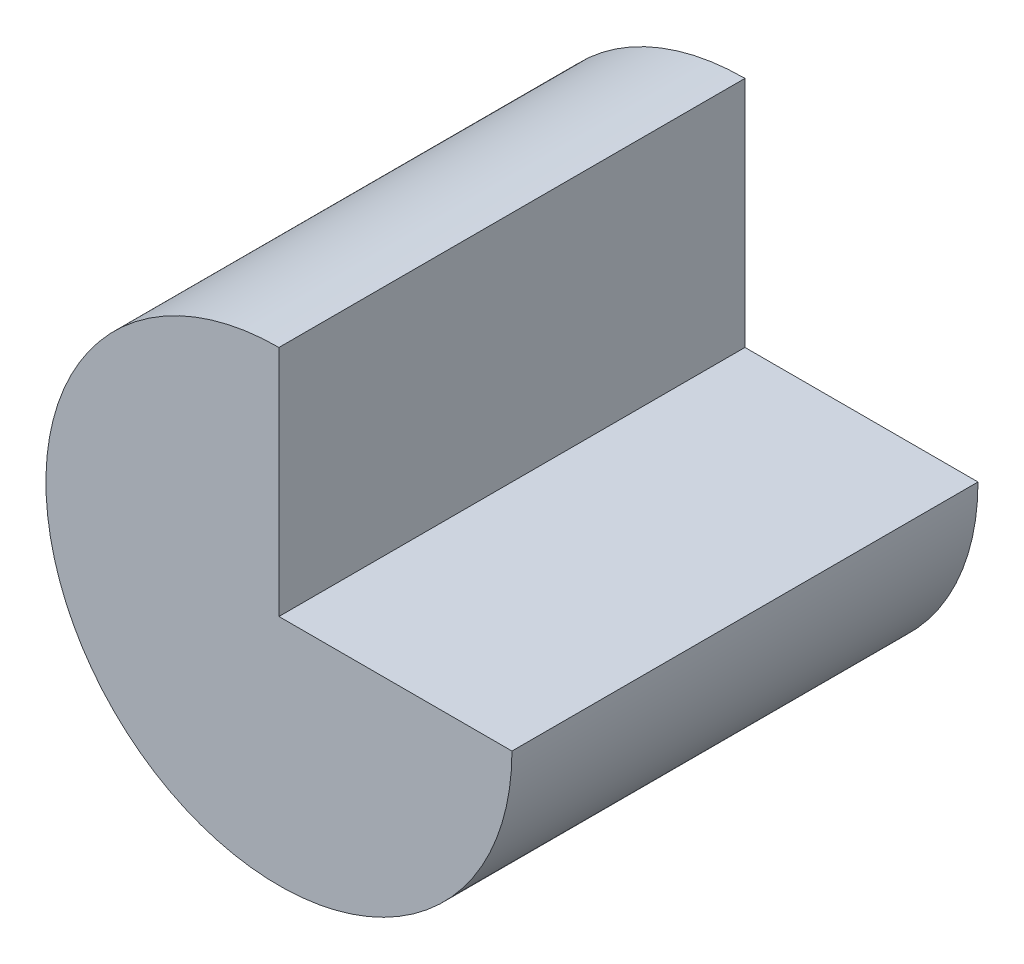
ISO-10303-21;
HEADER;
FILE_DESCRIPTION(('STEP AP214'),'2;1');
FILE_NAME('part.step','',(''),(''),'','','');
FILE_SCHEMA(('AUTOMOTIVE_DESIGN { 1 0 10303 214 1 1 1 1 }'));
ENDSEC;
DATA;
#1=APPLICATION_CONTEXT('core data for automotive mechanical design processes');
#2=APPLICATION_PROTOCOL_DEFINITION('international standard','automotive_design',2000,#1);
#3=PRODUCT_CONTEXT('',#1,'mechanical');
#4=PRODUCT('Part','Part','',(#3));
#5=PRODUCT_RELATED_PRODUCT_CATEGORY('part','',(#4));
#6=PRODUCT_DEFINITION_FORMATION('','',#4);
#7=PRODUCT_DEFINITION_CONTEXT('part definition',#1,'design');
#8=PRODUCT_DEFINITION('design','',#6,#7);
#9=PRODUCT_DEFINITION_SHAPE('','',#8);
#10=(LENGTH_UNIT() NAMED_UNIT(*) SI_UNIT(.MILLI.,.METRE.));
#11=(NAMED_UNIT(*) PLANE_ANGLE_UNIT() SI_UNIT($,.RADIAN.));
#12=(NAMED_UNIT(*) SI_UNIT($,.STERADIAN.) SOLID_ANGLE_UNIT());
#13=UNCERTAINTY_MEASURE_WITH_UNIT(LENGTH_MEASURE(1.E-05),#10,'distance_accuracy_value','');
#14=(GEOMETRIC_REPRESENTATION_CONTEXT(3) GLOBAL_UNCERTAINTY_ASSIGNED_CONTEXT((#13)) GLOBAL_UNIT_ASSIGNED_CONTEXT((#10,
#11,#12)) REPRESENTATION_CONTEXT('',''));
#15=CARTESIAN_POINT('',(0.,0.,0.));
#16=DIRECTION('',(0.,0.,1.));
#17=DIRECTION('',(1.,0.,0.));
#18=AXIS2_PLACEMENT_3D('',#15,#16,#17);
#19=CARTESIAN_POINT('',(0.,0.,-152.4));
#20=DIRECTION('',(0.,1.,0.));
#21=DIRECTION('',(0.,0.,1.));
#22=AXIS2_PLACEMENT_3D('',#19,#20,#21);
#23=PLANE('',#22);
#24=DIRECTION('',(-1.,0.,0.));
#25=VECTOR('',#24,1.);
#26=CARTESIAN_POINT('',(0.,0.,0.));
#27=LINE('',#26,#25);
#28=CARTESIAN_POINT('',(76.2,0.,0.));
#29=VERTEX_POINT('',#28);
#30=CARTESIAN_POINT('',(0.,0.,0.));
#31=VERTEX_POINT('',#30);
#32=EDGE_CURVE('E85',#29,#31,#27,.T.);
#33=ORIENTED_EDGE('',*,*,#32,.F.);
#34=DIRECTION('',(0.,0.,1.));
#35=VECTOR('',#34,1.);
#36=CARTESIAN_POINT('',(76.2,0.,-152.4));
#37=LINE('',#36,#35);
#38=CARTESIAN_POINT('',(76.2,0.,-152.4));
#39=VERTEX_POINT('',#38);
#40=EDGE_CURVE('E11',#39,#29,#37,.T.);
#41=ORIENTED_EDGE('',*,*,#40,.F.);
#42=DIRECTION('',(-1.,0.,0.));
#43=VECTOR('',#42,1.);
#44=CARTESIAN_POINT('',(0.,0.,-152.4));
#45=LINE('',#44,#43);
#46=CARTESIAN_POINT('',(0.,0.,-152.4));
#47=VERTEX_POINT('',#46);
#48=EDGE_CURVE('E77',#39,#47,#45,.T.);
#49=ORIENTED_EDGE('',*,*,#48,.T.);
#50=DIRECTION('',(0.,0.,1.));
#51=VECTOR('',#50,1.);
#52=CARTESIAN_POINT('',(0.,0.,-152.4));
#53=LINE('',#52,#51);
#54=EDGE_CURVE('E36',#47,#31,#53,.T.);
#55=ORIENTED_EDGE('',*,*,#54,.T.);
#56=EDGE_LOOP('',(#33,#41,#49,#55));
#57=FACE_BOUND('',#56,.T.);
#58=ADVANCED_FACE('F33',(#57),#23,.T.);
#59=CARTESIAN_POINT('',(0.,0.,-152.4));
#60=DIRECTION('',(0.,0.,1.));
#61=DIRECTION('',(1.,0.,0.));
#62=AXIS2_PLACEMENT_3D('',#59,#60,#61);
#63=CYLINDRICAL_SURFACE('',#62,76.2);
#64=CARTESIAN_POINT('',(0.,0.,0.));
#65=DIRECTION('',(0.,0.,1.));
#66=DIRECTION('',(1.,0.,0.));
#67=AXIS2_PLACEMENT_3D('',#64,#65,#66);
#68=CIRCLE('',#67,76.2);
#69=CARTESIAN_POINT('',(0.,76.2,0.));
#70=VERTEX_POINT('',#69);
#71=EDGE_CURVE('E79',#70,#29,#68,.T.);
#72=ORIENTED_EDGE('',*,*,#71,.F.);
#73=DIRECTION('',(0.,0.,1.));
#74=VECTOR('',#73,1.);
#75=CARTESIAN_POINT('',(0.,76.2,-152.4));
#76=LINE('',#75,#74);
#77=CARTESIAN_POINT('',(0.,76.2,-152.4));
#78=VERTEX_POINT('',#77);
#79=EDGE_CURVE('E42',#78,#70,#76,.T.);
#80=ORIENTED_EDGE('',*,*,#79,.F.);
#81=CARTESIAN_POINT('',(0.,0.,-152.4));
#82=DIRECTION('',(0.,0.,1.));
#83=DIRECTION('',(1.,0.,0.));
#84=AXIS2_PLACEMENT_3D('',#81,#82,#83);
#85=CIRCLE('',#84,76.2);
#86=EDGE_CURVE('E74',#78,#39,#85,.T.);
#87=ORIENTED_EDGE('',*,*,#86,.T.);
#88=ORIENTED_EDGE('',*,*,#40,.T.);
#89=EDGE_LOOP('',(#72,#80,#87,#88));
#90=FACE_BOUND('',#89,.T.);
#91=ADVANCED_FACE('F89',(#90),#63,.T.);
#92=CARTESIAN_POINT('',(0.,76.2,-152.4));
#93=DIRECTION('',(1.,0.,0.));
#94=DIRECTION('',(0.,0.,-1.));
#95=AXIS2_PLACEMENT_3D('',#92,#93,#94);
#96=PLANE('',#95);
#97=DIRECTION('',(0.,1.,0.));
#98=VECTOR('',#97,1.);
#99=CARTESIAN_POINT('',(0.,76.2,0.));
#100=LINE('',#99,#98);
#101=EDGE_CURVE('E72',#31,#70,#100,.T.);
#102=ORIENTED_EDGE('',*,*,#101,.F.);
#103=ORIENTED_EDGE('',*,*,#54,.F.);
#104=DIRECTION('',(0.,1.,0.));
#105=VECTOR('',#104,1.);
#106=CARTESIAN_POINT('',(0.,76.2,-152.4));
#107=LINE('',#106,#105);
#108=EDGE_CURVE('E70',#47,#78,#107,.T.);
#109=ORIENTED_EDGE('',*,*,#108,.T.);
#110=ORIENTED_EDGE('',*,*,#79,.T.);
#111=EDGE_LOOP('',(#102,#103,#109,#110));
#112=FACE_BOUND('',#111,.T.);
#113=ADVANCED_FACE('F69',(#112),#96,.T.);
#114=CARTESIAN_POINT('',(0.,0.,-152.4));
#115=DIRECTION('',(0.,0.,1.));
#116=DIRECTION('',(1.,0.,0.));
#117=AXIS2_PLACEMENT_3D('',#114,#115,#116);
#118=PLANE('',#117);
#119=ORIENTED_EDGE('',*,*,#48,.F.);
#120=ORIENTED_EDGE('',*,*,#86,.F.);
#121=ORIENTED_EDGE('',*,*,#108,.F.);
#122=EDGE_LOOP('',(#119,#120,#121));
#123=FACE_BOUND('',#122,.T.);
#124=ADVANCED_FACE('F76',(#123),#118,.F.);
#125=CARTESIAN_POINT('',(0.,0.,0.));
#126=DIRECTION('',(0.,0.,1.));
#127=DIRECTION('',(1.,0.,0.));
#128=AXIS2_PLACEMENT_3D('',#125,#126,#127);
#129=PLANE('',#128);
#130=ORIENTED_EDGE('',*,*,#32,.T.);
#131=ORIENTED_EDGE('',*,*,#101,.T.);
#132=ORIENTED_EDGE('',*,*,#71,.T.);
#133=EDGE_LOOP('',(#130,#131,#132));
#134=FACE_BOUND('',#133,.T.);
#135=ADVANCED_FACE('F88',(#134),#129,.T.);
#136=CLOSED_SHELL('',(#58,#91,#113,#124,#135));
#137=MANIFOLD_SOLID_BREP('B2',#136);
#138=ADVANCED_BREP_SHAPE_REPRESENTATION('',(#18,#137),#14);
#139=SHAPE_DEFINITION_REPRESENTATION(#9,#138);
ENDSEC;
END-ISO-10303-21;
